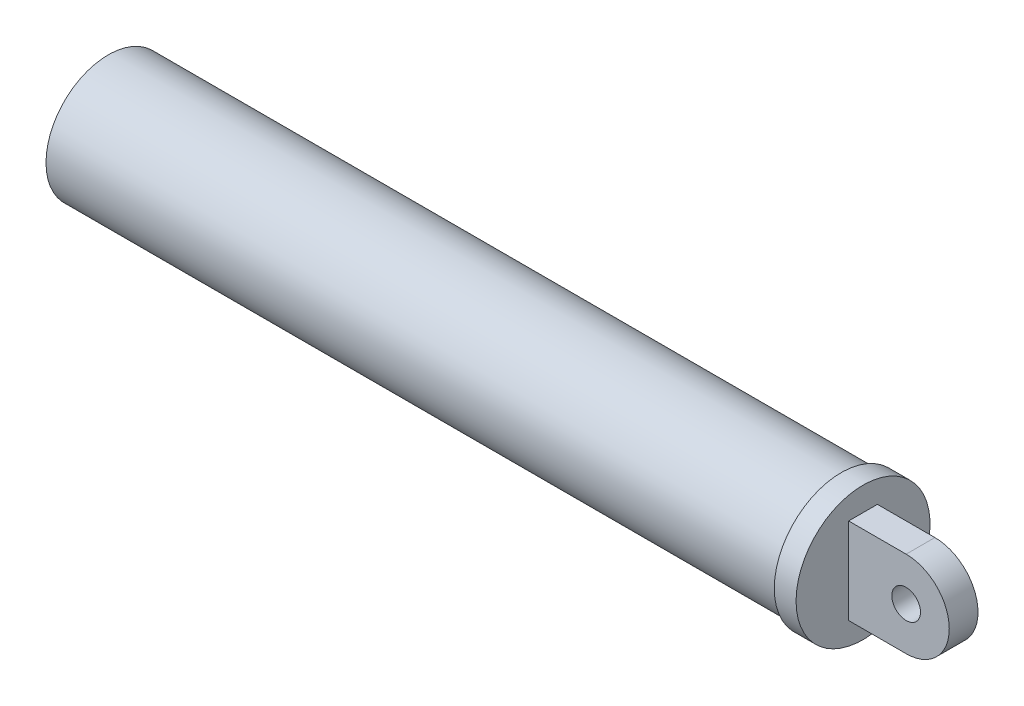
ISO-10303-21;
HEADER;
FILE_DESCRIPTION(('STEP AP214'),'2;1');
FILE_NAME('part.step','',(''),(''),'','','');
FILE_SCHEMA(('AUTOMOTIVE_DESIGN { 1 0 10303 214 1 1 1 1 }'));
ENDSEC;
DATA;
#1=APPLICATION_CONTEXT('core data for automotive mechanical design processes');
#2=APPLICATION_PROTOCOL_DEFINITION('international standard','automotive_design',2000,#1);
#3=PRODUCT_CONTEXT('',#1,'mechanical');
#4=PRODUCT('Part','Part','',(#3));
#5=PRODUCT_RELATED_PRODUCT_CATEGORY('part','',(#4));
#6=PRODUCT_DEFINITION_FORMATION('','',#4);
#7=PRODUCT_DEFINITION_CONTEXT('part definition',#1,'design');
#8=PRODUCT_DEFINITION('design','',#6,#7);
#9=PRODUCT_DEFINITION_SHAPE('','',#8);
#10=(LENGTH_UNIT() NAMED_UNIT(*) SI_UNIT(.MILLI.,.METRE.));
#11=(NAMED_UNIT(*) PLANE_ANGLE_UNIT() SI_UNIT($,.RADIAN.));
#12=(NAMED_UNIT(*) SI_UNIT($,.STERADIAN.) SOLID_ANGLE_UNIT());
#13=UNCERTAINTY_MEASURE_WITH_UNIT(LENGTH_MEASURE(1.E-05),#10,'distance_accuracy_value','');
#14=(GEOMETRIC_REPRESENTATION_CONTEXT(3) GLOBAL_UNCERTAINTY_ASSIGNED_CONTEXT((#13)) GLOBAL_UNIT_ASSIGNED_CONTEXT((#10,
#11,#12)) REPRESENTATION_CONTEXT('',''));
#15=CARTESIAN_POINT('',(0.,0.,0.));
#16=DIRECTION('',(0.,0.,1.));
#17=DIRECTION('',(1.,0.,0.));
#18=AXIS2_PLACEMENT_3D('',#15,#16,#17);
#19=CARTESIAN_POINT('',(319.568188367724,23.9815583439469,5.));
#20=DIRECTION('',(0.,0.,1.));
#21=DIRECTION('',(1.,0.,0.));
#22=AXIS2_PLACEMENT_3D('',#19,#20,#21);
#23=PLANE('',#22);
#24=DIRECTION('',(0.,-1.,0.));
#25=VECTOR('',#24,1.);
#26=CARTESIAN_POINT('',(299.568188367724,38.9815583439469,5.));
#27=LINE('',#26,#25);
#28=CARTESIAN_POINT('',(299.568188367724,38.9815583439469,5.));
#29=VERTEX_POINT('',#28);
#30=CARTESIAN_POINT('',(299.568188367724,8.98155834394689,5.));
#31=VERTEX_POINT('',#30);
#32=EDGE_CURVE('E96',#29,#31,#27,.T.);
#33=ORIENTED_EDGE('',*,*,#32,.T.);
#34=DIRECTION('',(1.,0.,0.));
#35=VECTOR('',#34,1.);
#36=CARTESIAN_POINT('',(299.568188367724,8.98155834394689,5.));
#37=LINE('',#36,#35);
#38=CARTESIAN_POINT('',(319.568188367724,8.98155834394688,5.));
#39=VERTEX_POINT('',#38);
#40=EDGE_CURVE('E75',#31,#39,#37,.T.);
#41=ORIENTED_EDGE('',*,*,#40,.T.);
#42=CARTESIAN_POINT('',(319.568188367724,23.9815583439469,5.));
#43=DIRECTION('',(0.,0.,1.));
#44=DIRECTION('',(1.,0.,0.));
#45=AXIS2_PLACEMENT_3D('',#42,#43,#44);
#46=CIRCLE('',#45,15.);
#47=CARTESIAN_POINT('',(319.568188367724,38.9815583439469,5.));
#48=VERTEX_POINT('',#47);
#49=EDGE_CURVE('E101',#39,#48,#46,.T.);
#50=ORIENTED_EDGE('',*,*,#49,.T.);
#51=DIRECTION('',(-1.,0.,0.));
#52=VECTOR('',#51,1.);
#53=CARTESIAN_POINT('',(299.568188367724,38.9815583439469,5.));
#54=LINE('',#53,#52);
#55=EDGE_CURVE('E50',#48,#29,#54,.T.);
#56=ORIENTED_EDGE('',*,*,#55,.T.);
#57=EDGE_LOOP('',(#33,#41,#50,#56));
#58=FACE_BOUND('',#57,.T.);
#59=CARTESIAN_POINT('',(319.568188367724,23.9815583439469,5.));
#60=DIRECTION('',(0.,0.,1.));
#61=DIRECTION('',(1.,0.,0.));
#62=AXIS2_PLACEMENT_3D('',#59,#60,#61);
#63=CIRCLE('',#62,4.99325294324576);
#64=CARTESIAN_POINT('',(324.561441310969,23.9815583439469,5.));
#65=VERTEX_POINT('',#64);
#66=EDGE_CURVE('E89',#65,#65,#63,.T.);
#67=ORIENTED_EDGE('',*,*,#66,.F.);
#68=EDGE_LOOP('',(#67));
#69=FACE_BOUND('',#68,.T.);
#70=ADVANCED_FACE('F33',(#58,#69),#23,.T.);
#71=CARTESIAN_POINT('',(319.568188367724,23.9815583439469,-5.));
#72=DIRECTION('',(0.,0.,1.));
#73=DIRECTION('',(1.,0.,0.));
#74=AXIS2_PLACEMENT_3D('',#71,#72,#73);
#75=PLANE('',#74);
#76=DIRECTION('',(0.,-1.,0.));
#77=VECTOR('',#76,1.);
#78=CARTESIAN_POINT('',(299.568188367724,38.9815583439469,-5.));
#79=LINE('',#78,#77);
#80=CARTESIAN_POINT('',(299.568188367724,38.9815583439469,-5.));
#81=VERTEX_POINT('',#80);
#82=CARTESIAN_POINT('',(299.568188367724,8.98155834394689,-5.));
#83=VERTEX_POINT('',#82);
#84=EDGE_CURVE('E81',#81,#83,#79,.T.);
#85=ORIENTED_EDGE('',*,*,#84,.F.);
#86=DIRECTION('',(-1.,0.,0.));
#87=VECTOR('',#86,1.);
#88=CARTESIAN_POINT('',(299.568188367724,38.9815583439469,-5.));
#89=LINE('',#88,#87);
#90=CARTESIAN_POINT('',(319.568188367724,38.9815583439469,-5.));
#91=VERTEX_POINT('',#90);
#92=EDGE_CURVE('E85',#91,#81,#89,.T.);
#93=ORIENTED_EDGE('',*,*,#92,.F.);
#94=CARTESIAN_POINT('',(319.568188367724,23.9815583439469,-5.));
#95=DIRECTION('',(0.,0.,1.));
#96=DIRECTION('',(1.,0.,0.));
#97=AXIS2_PLACEMENT_3D('',#94,#95,#96);
#98=CIRCLE('',#97,15.);
#99=CARTESIAN_POINT('',(319.568188367724,8.98155834394688,-5.));
#100=VERTEX_POINT('',#99);
#101=EDGE_CURVE('E70',#100,#91,#98,.T.);
#102=ORIENTED_EDGE('',*,*,#101,.F.);
#103=DIRECTION('',(1.,0.,0.));
#104=VECTOR('',#103,1.);
#105=CARTESIAN_POINT('',(299.568188367724,8.98155834394689,-5.));
#106=LINE('',#105,#104);
#107=EDGE_CURVE('E63',#83,#100,#106,.T.);
#108=ORIENTED_EDGE('',*,*,#107,.F.);
#109=EDGE_LOOP('',(#85,#93,#102,#108));
#110=FACE_BOUND('',#109,.T.);
#111=CARTESIAN_POINT('',(319.568188367724,23.9815583439469,-5.));
#112=DIRECTION('',(0.,0.,1.));
#113=DIRECTION('',(1.,0.,0.));
#114=AXIS2_PLACEMENT_3D('',#111,#112,#113);
#115=CIRCLE('',#114,4.99325294324576);
#116=CARTESIAN_POINT('',(324.561441310969,23.9815583439469,-5.));
#117=VERTEX_POINT('',#116);
#118=EDGE_CURVE('E111',#117,#117,#115,.T.);
#119=ORIENTED_EDGE('',*,*,#118,.T.);
#120=EDGE_LOOP('',(#119));
#121=FACE_BOUND('',#120,.T.);
#122=ADVANCED_FACE('F83',(#110,#121),#75,.F.);
#123=CARTESIAN_POINT('',(299.568188367724,8.98155834394689,5.));
#124=DIRECTION('',(0.,1.,0.));
#125=DIRECTION('',(0.,0.,1.));
#126=AXIS2_PLACEMENT_3D('',#123,#124,#125);
#127=PLANE('',#126);
#128=ORIENTED_EDGE('',*,*,#107,.T.);
#129=DIRECTION('',(0.,0.,-1.));
#130=VECTOR('',#129,1.);
#131=CARTESIAN_POINT('',(319.568188367724,8.98155834394688,5.));
#132=LINE('',#131,#130);
#133=EDGE_CURVE('E42',#39,#100,#132,.T.);
#134=ORIENTED_EDGE('',*,*,#133,.F.);
#135=ORIENTED_EDGE('',*,*,#40,.F.);
#136=DIRECTION('',(0.,0.,-1.));
#137=VECTOR('',#136,1.);
#138=CARTESIAN_POINT('',(299.568188367724,8.98155834394689,5.));
#139=LINE('',#138,#137);
#140=EDGE_CURVE('E11',#31,#83,#139,.T.);
#141=ORIENTED_EDGE('',*,*,#140,.T.);
#142=EDGE_LOOP('',(#128,#134,#135,#141));
#143=FACE_BOUND('',#142,.T.);
#144=ADVANCED_FACE('F35',(#143),#127,.F.);
#145=CARTESIAN_POINT('',(319.568188367724,23.9815583439469,5.));
#146=DIRECTION('',(0.,0.,-1.));
#147=DIRECTION('',(-1.,0.,0.));
#148=AXIS2_PLACEMENT_3D('',#145,#146,#147);
#149=CYLINDRICAL_SURFACE('',#148,15.);
#150=ORIENTED_EDGE('',*,*,#101,.T.);
#151=DIRECTION('',(0.,0.,-1.));
#152=VECTOR('',#151,1.);
#153=CARTESIAN_POINT('',(319.568188367724,38.9815583439469,5.));
#154=LINE('',#153,#152);
#155=EDGE_CURVE('E95',#48,#91,#154,.T.);
#156=ORIENTED_EDGE('',*,*,#155,.F.);
#157=ORIENTED_EDGE('',*,*,#49,.F.);
#158=ORIENTED_EDGE('',*,*,#133,.T.);
#159=EDGE_LOOP('',(#150,#156,#157,#158));
#160=FACE_BOUND('',#159,.T.);
#161=ADVANCED_FACE('F105',(#160),#149,.T.);
#162=CARTESIAN_POINT('',(299.568188367724,38.9815583439469,5.));
#163=DIRECTION('',(0.,-1.,0.));
#164=DIRECTION('',(1.,0.,0.));
#165=AXIS2_PLACEMENT_3D('',#162,#163,#164);
#166=PLANE('',#165);
#167=ORIENTED_EDGE('',*,*,#92,.T.);
#168=DIRECTION('',(0.,0.,-1.));
#169=VECTOR('',#168,1.);
#170=CARTESIAN_POINT('',(299.568188367724,38.9815583439469,5.));
#171=LINE('',#170,#169);
#172=EDGE_CURVE('E93',#29,#81,#171,.T.);
#173=ORIENTED_EDGE('',*,*,#172,.F.);
#174=ORIENTED_EDGE('',*,*,#55,.F.);
#175=ORIENTED_EDGE('',*,*,#155,.T.);
#176=EDGE_LOOP('',(#167,#173,#174,#175));
#177=FACE_BOUND('',#176,.T.);
#178=ADVANCED_FACE('F92',(#177),#166,.F.);
#179=CARTESIAN_POINT('',(319.568188367724,23.9815583439469,5.));
#180=DIRECTION('',(0.,0.,-1.));
#181=DIRECTION('',(-1.,0.,0.));
#182=AXIS2_PLACEMENT_3D('',#179,#180,#181);
#183=CYLINDRICAL_SURFACE('',#182,4.99325294324576);
#184=ORIENTED_EDGE('',*,*,#66,.T.);
#185=EDGE_LOOP('',(#184));
#186=FACE_BOUND('',#185,.T.);
#187=ORIENTED_EDGE('',*,*,#118,.F.);
#188=EDGE_LOOP('',(#187));
#189=FACE_BOUND('',#188,.T.);
#190=ADVANCED_FACE('F157',(#186,#189),#183,.F.);
#191=CARTESIAN_POINT('',(299.568188367724,38.9815583439469,0.));
#192=DIRECTION('',(-1.,0.,0.));
#193=DIRECTION('',(0.,0.,1.));
#194=AXIS2_PLACEMENT_3D('',#191,#192,#193);
#195=PLANE('',#194);
#196=CARTESIAN_POINT('',(299.568188367724,23.9815583439469,0.));
#197=DIRECTION('',(-1.,0.,0.));
#198=DIRECTION('',(0.,0.,1.));
#199=AXIS2_PLACEMENT_3D('',#196,#197,#198);
#200=CIRCLE('',#199,23.2996609030371);
#201=CARTESIAN_POINT('',(299.568188367724,23.9815583439469,23.2996609030371));
#202=VERTEX_POINT('',#201);
#203=EDGE_CURVE('E122',#202,#202,#200,.T.);
#204=ORIENTED_EDGE('',*,*,#203,.F.);
#205=EDGE_LOOP('',(#204));
#206=FACE_BOUND('',#205,.T.);
#207=ORIENTED_EDGE('',*,*,#84,.T.);
#208=ORIENTED_EDGE('',*,*,#140,.F.);
#209=ORIENTED_EDGE('',*,*,#32,.F.);
#210=ORIENTED_EDGE('',*,*,#172,.T.);
#211=EDGE_LOOP('',(#207,#208,#209,#210));
#212=FACE_BOUND('',#211,.T.);
#213=ADVANCED_FACE('F98',(#206,#212),#195,.F.);
#214=CARTESIAN_POINT('',(286.998587327078,23.9815583439469,0.));
#215=DIRECTION('',(-1.,0.,0.));
#216=DIRECTION('',(0.,0.,1.));
#217=AXIS2_PLACEMENT_3D('',#214,#215,#216);
#218=CYLINDRICAL_SURFACE('',#217,21.6731522740665);
#219=CARTESIAN_POINT('',(36.9985873270776,23.9815583439469,0.));
#220=DIRECTION('',(-1.,0.,0.));
#221=DIRECTION('',(0.,0.,1.));
#222=AXIS2_PLACEMENT_3D('',#219,#220,#221);
#223=CIRCLE('',#222,21.6731522740665);
#224=CARTESIAN_POINT('',(36.9985873270776,23.9815583439469,21.6731522740665));
#225=VERTEX_POINT('',#224);
#226=EDGE_CURVE('E131',#225,#225,#223,.T.);
#227=ORIENTED_EDGE('',*,*,#226,.F.);
#228=EDGE_LOOP('',(#227));
#229=FACE_BOUND('',#228,.T.);
#230=CARTESIAN_POINT('',(291.998587327078,23.9815583439469,0.));
#231=DIRECTION('',(-1.,0.,0.));
#232=DIRECTION('',(0.,0.,1.));
#233=AXIS2_PLACEMENT_3D('',#230,#231,#232);
#234=CIRCLE('',#233,21.6731522740665);
#235=CARTESIAN_POINT('',(291.998587327078,23.9815583439469,21.6731522740665));
#236=VERTEX_POINT('',#235);
#237=EDGE_CURVE('E114',#236,#236,#234,.T.);
#238=ORIENTED_EDGE('',*,*,#237,.T.);
#239=EDGE_LOOP('',(#238));
#240=FACE_BOUND('',#239,.T.);
#241=ADVANCED_FACE('F137',(#229,#240),#218,.T.);
#242=CARTESIAN_POINT('',(291.998587327078,45.6547106180134,0.));
#243=DIRECTION('',(1.,0.,0.));
#244=DIRECTION('',(0.,0.,-1.));
#245=AXIS2_PLACEMENT_3D('',#242,#243,#244);
#246=PLANE('',#245);
#247=ORIENTED_EDGE('',*,*,#237,.F.);
#248=EDGE_LOOP('',(#247));
#249=FACE_BOUND('',#248,.T.);
#250=CARTESIAN_POINT('',(291.998587327078,23.9815583439469,0.));
#251=DIRECTION('',(-1.,0.,0.));
#252=DIRECTION('',(0.,0.,1.));
#253=AXIS2_PLACEMENT_3D('',#250,#251,#252);
#254=CIRCLE('',#253,23.2996609030371);
#255=CARTESIAN_POINT('',(291.998587327078,23.9815583439469,23.2996609030371));
#256=VERTEX_POINT('',#255);
#257=EDGE_CURVE('E119',#256,#256,#254,.T.);
#258=ORIENTED_EDGE('',*,*,#257,.T.);
#259=EDGE_LOOP('',(#258));
#260=FACE_BOUND('',#259,.T.);
#261=ADVANCED_FACE('F140',(#249,#260),#246,.F.);
#262=CARTESIAN_POINT('',(286.998587327078,23.9815583439469,0.));
#263=DIRECTION('',(-1.,0.,0.));
#264=DIRECTION('',(0.,0.,1.));
#265=AXIS2_PLACEMENT_3D('',#262,#263,#264);
#266=CYLINDRICAL_SURFACE('',#265,23.2996609030371);
#267=ORIENTED_EDGE('',*,*,#257,.F.);
#268=EDGE_LOOP('',(#267));
#269=FACE_BOUND('',#268,.T.);
#270=ORIENTED_EDGE('',*,*,#203,.T.);
#271=EDGE_LOOP('',(#270));
#272=FACE_BOUND('',#271,.T.);
#273=ADVANCED_FACE('F146',(#269,#272),#266,.T.);
#274=CARTESIAN_POINT('',(286.998587327078,39.6107870099613,0.));
#275=DIRECTION('',(1.,0.,0.));
#276=DIRECTION('',(0.,0.,-1.));
#277=AXIS2_PLACEMENT_3D('',#274,#275,#276);
#278=PLANE('',#277);
#279=CARTESIAN_POINT('',(286.998587327078,23.9815583439469,0.));
#280=DIRECTION('',(-1.,0.,0.));
#281=DIRECTION('',(0.,0.,1.));
#282=AXIS2_PLACEMENT_3D('',#279,#280,#281);
#283=CIRCLE('',#282,15.6292286660144);
#284=CARTESIAN_POINT('',(286.998587327078,23.9815583439469,15.6292286660144));
#285=VERTEX_POINT('',#284);
#286=EDGE_CURVE('E125',#285,#285,#283,.T.);
#287=ORIENTED_EDGE('',*,*,#286,.T.);
#288=EDGE_LOOP('',(#287));
#289=FACE_BOUND('',#288,.T.);
#290=ADVANCED_FACE('F152',(#289),#278,.F.);
#291=CARTESIAN_POINT('',(286.998587327078,23.9815583439469,0.));
#292=DIRECTION('',(-1.,0.,0.));
#293=DIRECTION('',(0.,0.,1.));
#294=AXIS2_PLACEMENT_3D('',#291,#292,#293);
#295=CYLINDRICAL_SURFACE('',#294,15.6292286660144);
#296=ORIENTED_EDGE('',*,*,#286,.F.);
#297=EDGE_LOOP('',(#296));
#298=FACE_BOUND('',#297,.T.);
#299=CARTESIAN_POINT('',(36.9985873270776,23.9815583439469,0.));
#300=DIRECTION('',(-1.,0.,0.));
#301=DIRECTION('',(0.,0.,1.));
#302=AXIS2_PLACEMENT_3D('',#299,#300,#301);
#303=CIRCLE('',#302,15.6292286660144);
#304=CARTESIAN_POINT('',(36.9985873270776,23.9815583439469,15.6292286660144));
#305=VERTEX_POINT('',#304);
#306=EDGE_CURVE('E128',#305,#305,#303,.T.);
#307=ORIENTED_EDGE('',*,*,#306,.T.);
#308=EDGE_LOOP('',(#307));
#309=FACE_BOUND('',#308,.T.);
#310=ADVANCED_FACE('F238',(#298,#309),#295,.F.);
#311=CARTESIAN_POINT('',(36.9985873270776,39.6107870099613,0.));
#312=DIRECTION('',(1.,0.,0.));
#313=DIRECTION('',(0.,0.,-1.));
#314=AXIS2_PLACEMENT_3D('',#311,#312,#313);
#315=PLANE('',#314);
#316=ORIENTED_EDGE('',*,*,#306,.F.);
#317=EDGE_LOOP('',(#316));
#318=FACE_BOUND('',#317,.T.);
#319=ORIENTED_EDGE('',*,*,#226,.T.);
#320=EDGE_LOOP('',(#319));
#321=FACE_BOUND('',#320,.T.);
#322=ADVANCED_FACE('F135',(#318,#321),#315,.F.);
#323=CLOSED_SHELL('',(#70,#122,#144,#161,#178,#190,#213,#241,#261,#273,#290,#310,#322));
#324=MANIFOLD_SOLID_BREP('B2',#323);
#325=ADVANCED_BREP_SHAPE_REPRESENTATION('',(#18,#324),#14);
#326=SHAPE_DEFINITION_REPRESENTATION(#9,#325);
ENDSEC;
END-ISO-10303-21;
